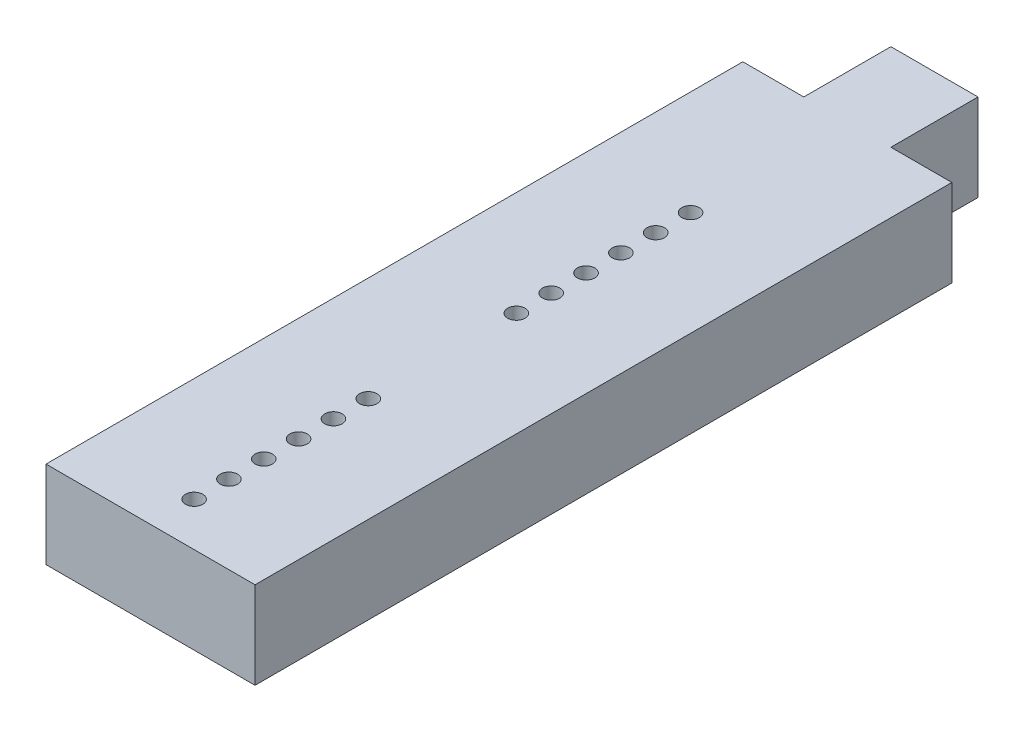
ISO-10303-21;
HEADER;
FILE_DESCRIPTION(('STEP AP214'),'2;1');
FILE_NAME('part.step','',(''),(''),'','','');
FILE_SCHEMA(('AUTOMOTIVE_DESIGN { 1 0 10303 214 1 1 1 1 }'));
ENDSEC;
DATA;
#1=APPLICATION_CONTEXT('core data for automotive mechanical design processes');
#2=APPLICATION_PROTOCOL_DEFINITION('international standard','automotive_design',2000,#1);
#3=PRODUCT_CONTEXT('',#1,'mechanical');
#4=PRODUCT('Part','Part','',(#3));
#5=PRODUCT_RELATED_PRODUCT_CATEGORY('part','',(#4));
#6=PRODUCT_DEFINITION_FORMATION('','',#4);
#7=PRODUCT_DEFINITION_CONTEXT('part definition',#1,'design');
#8=PRODUCT_DEFINITION('design','',#6,#7);
#9=PRODUCT_DEFINITION_SHAPE('','',#8);
#10=(LENGTH_UNIT() NAMED_UNIT(*) SI_UNIT(.MILLI.,.METRE.));
#11=(NAMED_UNIT(*) PLANE_ANGLE_UNIT() SI_UNIT($,.RADIAN.));
#12=(NAMED_UNIT(*) SI_UNIT($,.STERADIAN.) SOLID_ANGLE_UNIT());
#13=UNCERTAINTY_MEASURE_WITH_UNIT(LENGTH_MEASURE(1.E-05),#10,'distance_accuracy_value','');
#14=(GEOMETRIC_REPRESENTATION_CONTEXT(3) GLOBAL_UNCERTAINTY_ASSIGNED_CONTEXT((#13)) GLOBAL_UNIT_ASSIGNED_CONTEXT((#10,
#11,#12)) REPRESENTATION_CONTEXT('',''));
#15=CARTESIAN_POINT('',(0.,0.,0.));
#16=DIRECTION('',(0.,0.,1.));
#17=DIRECTION('',(1.,0.,0.));
#18=AXIS2_PLACEMENT_3D('',#15,#16,#17);
#19=CARTESIAN_POINT('',(0.,5.,0.));
#20=DIRECTION('',(0.,1.,0.));
#21=DIRECTION('',(0.,0.,1.));
#22=AXIS2_PLACEMENT_3D('',#19,#20,#21);
#23=PLANE('',#22);
#24=CARTESIAN_POINT('',(0.,5.,15.5));
#25=DIRECTION('',(0.,1.,0.));
#26=DIRECTION('',(0.,0.,1.));
#27=AXIS2_PLACEMENT_3D('',#24,#25,#26);
#28=CIRCLE('',#27,0.500000000000001);
#29=CARTESIAN_POINT('',(0.,5.,16.));
#30=VERTEX_POINT('',#29);
#31=EDGE_CURVE('E240',#30,#30,#28,.T.);
#32=ORIENTED_EDGE('',*,*,#31,.F.);
#33=EDGE_LOOP('',(#32));
#34=FACE_BOUND('',#33,.T.);
#35=CARTESIAN_POINT('',(0.,5.,11.5));
#36=DIRECTION('',(0.,1.,0.));
#37=DIRECTION('',(0.,0.,1.));
#38=AXIS2_PLACEMENT_3D('',#35,#36,#37);
#39=CIRCLE('',#38,0.500000000000001);
#40=CARTESIAN_POINT('',(0.,5.,12.));
#41=VERTEX_POINT('',#40);
#42=EDGE_CURVE('E228',#41,#41,#39,.T.);
#43=ORIENTED_EDGE('',*,*,#42,.F.);
#44=EDGE_LOOP('',(#43));
#45=FACE_BOUND('',#44,.T.);
#46=CARTESIAN_POINT('',(0.,5.,7.50000000000001));
#47=DIRECTION('',(0.,1.,0.));
#48=DIRECTION('',(0.,0.,1.));
#49=AXIS2_PLACEMENT_3D('',#46,#47,#48);
#50=CIRCLE('',#49,0.500000000000001);
#51=CARTESIAN_POINT('',(0.,5.,8.00000000000001));
#52=VERTEX_POINT('',#51);
#53=EDGE_CURVE('E216',#52,#52,#50,.T.);
#54=ORIENTED_EDGE('',*,*,#53,.F.);
#55=EDGE_LOOP('',(#54));
#56=FACE_BOUND('',#55,.T.);
#57=CARTESIAN_POINT('',(0.,5.,-3.));
#58=DIRECTION('',(0.,1.,0.));
#59=DIRECTION('',(0.,0.,1.));
#60=AXIS2_PLACEMENT_3D('',#57,#58,#59);
#61=CIRCLE('',#60,0.500000000000001);
#62=CARTESIAN_POINT('',(0.,5.,-2.5));
#63=VERTEX_POINT('',#62);
#64=EDGE_CURVE('E204',#63,#63,#61,.T.);
#65=ORIENTED_EDGE('',*,*,#64,.F.);
#66=EDGE_LOOP('',(#65));
#67=FACE_BOUND('',#66,.T.);
#68=CARTESIAN_POINT('',(0.,5.,-7.00000000000001));
#69=DIRECTION('',(0.,1.,0.));
#70=DIRECTION('',(0.,0.,1.));
#71=AXIS2_PLACEMENT_3D('',#68,#69,#70);
#72=CIRCLE('',#71,0.500000000000001);
#73=CARTESIAN_POINT('',(0.,5.,-6.50000000000001));
#74=VERTEX_POINT('',#73);
#75=EDGE_CURVE('E192',#74,#74,#72,.T.);
#76=ORIENTED_EDGE('',*,*,#75,.F.);
#77=EDGE_LOOP('',(#76));
#78=FACE_BOUND('',#77,.T.);
#79=CARTESIAN_POINT('',(0.,5.,-11.));
#80=DIRECTION('',(0.,1.,0.));
#81=DIRECTION('',(0.,0.,1.));
#82=AXIS2_PLACEMENT_3D('',#79,#80,#81);
#83=CIRCLE('',#82,0.500000000000001);
#84=CARTESIAN_POINT('',(0.,5.,-10.5));
#85=VERTEX_POINT('',#84);
#86=EDGE_CURVE('E138',#85,#85,#83,.T.);
#87=ORIENTED_EDGE('',*,*,#86,.F.);
#88=EDGE_LOOP('',(#87));
#89=FACE_BOUND('',#88,.T.);
#90=DIRECTION('',(0.,0.,-1.));
#91=VECTOR('',#90,1.);
#92=CARTESIAN_POINT('',(6.,5.,-20.0000000000001));
#93=LINE('',#92,#91);
#94=CARTESIAN_POINT('',(6.00000000000001,5.,19.9999999999999));
#95=VERTEX_POINT('',#94);
#96=CARTESIAN_POINT('',(6.,5.,-20.0000000000001));
#97=VERTEX_POINT('',#96);
#98=EDGE_CURVE('E149',#95,#97,#93,.T.);
#99=ORIENTED_EDGE('',*,*,#98,.T.);
#100=DIRECTION('',(-1.,0.,0.));
#101=VECTOR('',#100,1.);
#102=CARTESIAN_POINT('',(2.5,5.,-20.0000000000001));
#103=LINE('',#102,#101);
#104=CARTESIAN_POINT('',(2.5,5.,-20.0000000000001));
#105=VERTEX_POINT('',#104);
#106=EDGE_CURVE('E97',#97,#105,#103,.T.);
#107=ORIENTED_EDGE('',*,*,#106,.T.);
#108=DIRECTION('',(0.,0.,-1.));
#109=VECTOR('',#108,1.);
#110=CARTESIAN_POINT('',(2.49999999999993,5.,-25.));
#111=LINE('',#110,#109);
#112=CARTESIAN_POINT('',(2.49999999999993,5.,-25.));
#113=VERTEX_POINT('',#112);
#114=EDGE_CURVE('E164',#105,#113,#111,.T.);
#115=ORIENTED_EDGE('',*,*,#114,.T.);
#116=DIRECTION('',(-1.,0.,0.));
#117=VECTOR('',#116,1.);
#118=CARTESIAN_POINT('',(-2.50000000000007,5.,-25.0000000000003));
#119=LINE('',#118,#117);
#120=CARTESIAN_POINT('',(-2.50000000000007,5.,-25.0000000000003));
#121=VERTEX_POINT('',#120);
#122=EDGE_CURVE('E177',#113,#121,#119,.T.);
#123=ORIENTED_EDGE('',*,*,#122,.T.);
#124=DIRECTION('',(0.,0.,1.));
#125=VECTOR('',#124,1.);
#126=CARTESIAN_POINT('',(-2.5,5.,-20.));
#127=LINE('',#126,#125);
#128=CARTESIAN_POINT('',(-2.5,5.,-20.));
#129=VERTEX_POINT('',#128);
#130=EDGE_CURVE('E116',#121,#129,#127,.T.);
#131=ORIENTED_EDGE('',*,*,#130,.T.);
#132=DIRECTION('',(-1.,0.,0.));
#133=VECTOR('',#132,1.);
#134=CARTESIAN_POINT('',(-6.00000000000001,5.,-20.));
#135=LINE('',#134,#133);
#136=CARTESIAN_POINT('',(-6.00000000000001,5.,-20.));
#137=VERTEX_POINT('',#136);
#138=EDGE_CURVE('E110',#129,#137,#135,.T.);
#139=ORIENTED_EDGE('',*,*,#138,.T.);
#140=DIRECTION('',(0.,0.,1.));
#141=VECTOR('',#140,1.);
#142=CARTESIAN_POINT('',(-6.00000000000001,5.,-20.));
#143=LINE('',#142,#141);
#144=CARTESIAN_POINT('',(-6.,5.,20.));
#145=VERTEX_POINT('',#144);
#146=EDGE_CURVE('E114',#137,#145,#143,.T.);
#147=ORIENTED_EDGE('',*,*,#146,.T.);
#148=DIRECTION('',(1.,0.,0.));
#149=VECTOR('',#148,1.);
#150=CARTESIAN_POINT('',(-6.,5.,20.));
#151=LINE('',#150,#149);
#152=EDGE_CURVE('E54',#145,#95,#151,.T.);
#153=ORIENTED_EDGE('',*,*,#152,.T.);
#154=EDGE_LOOP('',(#99,#107,#115,#123,#131,#139,#147,#153));
#155=FACE_BOUND('',#154,.T.);
#156=CARTESIAN_POINT('',(0.,5.,-9.00000000000001));
#157=DIRECTION('',(0.,1.,0.));
#158=DIRECTION('',(0.,0.,1.));
#159=AXIS2_PLACEMENT_3D('',#156,#157,#158);
#160=CIRCLE('',#159,0.500000000000001);
#161=CARTESIAN_POINT('',(0.,5.,-8.50000000000001));
#162=VERTEX_POINT('',#161);
#163=EDGE_CURVE('E186',#162,#162,#160,.T.);
#164=ORIENTED_EDGE('',*,*,#163,.F.);
#165=EDGE_LOOP('',(#164));
#166=FACE_BOUND('',#165,.T.);
#167=CARTESIAN_POINT('',(0.,5.,-5.));
#168=DIRECTION('',(0.,1.,0.));
#169=DIRECTION('',(0.,0.,1.));
#170=AXIS2_PLACEMENT_3D('',#167,#168,#169);
#171=CIRCLE('',#170,0.500000000000001);
#172=CARTESIAN_POINT('',(0.,5.,-4.5));
#173=VERTEX_POINT('',#172);
#174=EDGE_CURVE('E198',#173,#173,#171,.T.);
#175=ORIENTED_EDGE('',*,*,#174,.F.);
#176=EDGE_LOOP('',(#175));
#177=FACE_BOUND('',#176,.T.);
#178=CARTESIAN_POINT('',(0.,5.,-1.));
#179=DIRECTION('',(0.,1.,0.));
#180=DIRECTION('',(0.,0.,1.));
#181=AXIS2_PLACEMENT_3D('',#178,#179,#180);
#182=CIRCLE('',#181,0.5);
#183=CARTESIAN_POINT('',(0.,5.,-0.500000000000001));
#184=VERTEX_POINT('',#183);
#185=EDGE_CURVE('E210',#184,#184,#182,.T.);
#186=ORIENTED_EDGE('',*,*,#185,.F.);
#187=EDGE_LOOP('',(#186));
#188=FACE_BOUND('',#187,.T.);
#189=CARTESIAN_POINT('',(0.,5.,9.49999999999999));
#190=DIRECTION('',(0.,1.,0.));
#191=DIRECTION('',(0.,0.,1.));
#192=AXIS2_PLACEMENT_3D('',#189,#190,#191);
#193=CIRCLE('',#192,0.500000000000001);
#194=CARTESIAN_POINT('',(0.,5.,9.99999999999999));
#195=VERTEX_POINT('',#194);
#196=EDGE_CURVE('E222',#195,#195,#193,.T.);
#197=ORIENTED_EDGE('',*,*,#196,.F.);
#198=EDGE_LOOP('',(#197));
#199=FACE_BOUND('',#198,.T.);
#200=CARTESIAN_POINT('',(0.,5.,13.5));
#201=DIRECTION('',(0.,1.,0.));
#202=DIRECTION('',(0.,0.,1.));
#203=AXIS2_PLACEMENT_3D('',#200,#201,#202);
#204=CIRCLE('',#203,0.500000000000001);
#205=CARTESIAN_POINT('',(0.,5.,14.));
#206=VERTEX_POINT('',#205);
#207=EDGE_CURVE('E234',#206,#206,#204,.T.);
#208=ORIENTED_EDGE('',*,*,#207,.F.);
#209=EDGE_LOOP('',(#208));
#210=FACE_BOUND('',#209,.T.);
#211=CARTESIAN_POINT('',(1.04083408558608E-13,5.,17.5));
#212=DIRECTION('',(0.,1.,0.));
#213=DIRECTION('',(0.,0.,1.));
#214=AXIS2_PLACEMENT_3D('',#211,#212,#213);
#215=CIRCLE('',#214,0.500000000000001);
#216=CARTESIAN_POINT('',(1.04360964314765E-13,5.,18.));
#217=VERTEX_POINT('',#216);
#218=EDGE_CURVE('E246',#217,#217,#215,.T.);
#219=ORIENTED_EDGE('',*,*,#218,.F.);
#220=EDGE_LOOP('',(#219));
#221=FACE_BOUND('',#220,.T.);
#222=ADVANCED_FACE('F37',(#34,#45,#56,#67,#78,#89,#155,#166,#177,#188,#199,#210,#221),#23,.T.);
#223=CARTESIAN_POINT('',(0.,0.,0.));
#224=DIRECTION('',(0.,1.,0.));
#225=DIRECTION('',(0.,0.,1.));
#226=AXIS2_PLACEMENT_3D('',#223,#224,#225);
#227=PLANE('',#226);
#228=DIRECTION('',(0.,0.,-1.));
#229=VECTOR('',#228,1.);
#230=CARTESIAN_POINT('',(6.,0.,-20.0000000000001));
#231=LINE('',#230,#229);
#232=CARTESIAN_POINT('',(6.00000000000001,0.,19.9999999999999));
#233=VERTEX_POINT('',#232);
#234=CARTESIAN_POINT('',(6.,0.,-20.0000000000001));
#235=VERTEX_POINT('',#234);
#236=EDGE_CURVE('E134',#233,#235,#231,.T.);
#237=ORIENTED_EDGE('',*,*,#236,.F.);
#238=DIRECTION('',(1.,0.,0.));
#239=VECTOR('',#238,1.);
#240=CARTESIAN_POINT('',(-6.,0.,20.));
#241=LINE('',#240,#239);
#242=CARTESIAN_POINT('',(-6.,0.,20.));
#243=VERTEX_POINT('',#242);
#244=EDGE_CURVE('E89',#243,#233,#241,.T.);
#245=ORIENTED_EDGE('',*,*,#244,.F.);
#246=DIRECTION('',(0.,0.,1.));
#247=VECTOR('',#246,1.);
#248=CARTESIAN_POINT('',(-6.00000000000001,0.,-20.));
#249=LINE('',#248,#247);
#250=CARTESIAN_POINT('',(-6.00000000000001,0.,-20.));
#251=VERTEX_POINT('',#250);
#252=EDGE_CURVE('E83',#251,#243,#249,.T.);
#253=ORIENTED_EDGE('',*,*,#252,.F.);
#254=DIRECTION('',(-1.,0.,0.));
#255=VECTOR('',#254,1.);
#256=CARTESIAN_POINT('',(-6.00000000000001,0.,-20.));
#257=LINE('',#256,#255);
#258=CARTESIAN_POINT('',(-2.5,0.,-20.));
#259=VERTEX_POINT('',#258);
#260=EDGE_CURVE('E124',#259,#251,#257,.T.);
#261=ORIENTED_EDGE('',*,*,#260,.F.);
#262=DIRECTION('',(0.,0.,1.));
#263=VECTOR('',#262,1.);
#264=CARTESIAN_POINT('',(-2.5,0.,-20.));
#265=LINE('',#264,#263);
#266=CARTESIAN_POINT('',(-2.50000000000007,0.,-25.0000000000003));
#267=VERTEX_POINT('',#266);
#268=EDGE_CURVE('E144',#267,#259,#265,.T.);
#269=ORIENTED_EDGE('',*,*,#268,.F.);
#270=DIRECTION('',(-1.,0.,0.));
#271=VECTOR('',#270,1.);
#272=CARTESIAN_POINT('',(-2.50000000000007,0.,-25.0000000000003));
#273=LINE('',#272,#271);
#274=CARTESIAN_POINT('',(2.49999999999993,0.,-25.));
#275=VERTEX_POINT('',#274);
#276=EDGE_CURVE('E142',#275,#267,#273,.T.);
#277=ORIENTED_EDGE('',*,*,#276,.F.);
#278=DIRECTION('',(0.,0.,-1.));
#279=VECTOR('',#278,1.);
#280=CARTESIAN_POINT('',(2.49999999999993,0.,-25.));
#281=LINE('',#280,#279);
#282=CARTESIAN_POINT('',(2.5,0.,-20.0000000000001));
#283=VERTEX_POINT('',#282);
#284=EDGE_CURVE('E140',#283,#275,#281,.T.);
#285=ORIENTED_EDGE('',*,*,#284,.F.);
#286=DIRECTION('',(-1.,0.,0.));
#287=VECTOR('',#286,1.);
#288=CARTESIAN_POINT('',(2.5,0.,-20.0000000000001));
#289=LINE('',#288,#287);
#290=EDGE_CURVE('E137',#235,#283,#289,.T.);
#291=ORIENTED_EDGE('',*,*,#290,.F.);
#292=EDGE_LOOP('',(#237,#245,#253,#261,#269,#277,#285,#291));
#293=FACE_BOUND('',#292,.T.);
#294=CARTESIAN_POINT('',(0.,0.,-11.));
#295=DIRECTION('',(0.,1.,0.));
#296=DIRECTION('',(0.,0.,1.));
#297=AXIS2_PLACEMENT_3D('',#294,#295,#296);
#298=CIRCLE('',#297,0.500000000000001);
#299=CARTESIAN_POINT('',(0.,0.,-10.5));
#300=VERTEX_POINT('',#299);
#301=EDGE_CURVE('E183',#300,#300,#298,.T.);
#302=ORIENTED_EDGE('',*,*,#301,.T.);
#303=EDGE_LOOP('',(#302));
#304=FACE_BOUND('',#303,.T.);
#305=CARTESIAN_POINT('',(0.,0.,-9.00000000000001));
#306=DIRECTION('',(0.,1.,0.));
#307=DIRECTION('',(0.,0.,1.));
#308=AXIS2_PLACEMENT_3D('',#305,#306,#307);
#309=CIRCLE('',#308,0.500000000000001);
#310=CARTESIAN_POINT('',(0.,0.,-8.50000000000001));
#311=VERTEX_POINT('',#310);
#312=EDGE_CURVE('E189',#311,#311,#309,.T.);
#313=ORIENTED_EDGE('',*,*,#312,.T.);
#314=EDGE_LOOP('',(#313));
#315=FACE_BOUND('',#314,.T.);
#316=CARTESIAN_POINT('',(0.,0.,-7.00000000000001));
#317=DIRECTION('',(0.,1.,0.));
#318=DIRECTION('',(0.,0.,1.));
#319=AXIS2_PLACEMENT_3D('',#316,#317,#318);
#320=CIRCLE('',#319,0.500000000000001);
#321=CARTESIAN_POINT('',(0.,0.,-6.50000000000001));
#322=VERTEX_POINT('',#321);
#323=EDGE_CURVE('E195',#322,#322,#320,.T.);
#324=ORIENTED_EDGE('',*,*,#323,.T.);
#325=EDGE_LOOP('',(#324));
#326=FACE_BOUND('',#325,.T.);
#327=CARTESIAN_POINT('',(0.,0.,-5.));
#328=DIRECTION('',(0.,1.,0.));
#329=DIRECTION('',(0.,0.,1.));
#330=AXIS2_PLACEMENT_3D('',#327,#328,#329);
#331=CIRCLE('',#330,0.500000000000001);
#332=CARTESIAN_POINT('',(0.,0.,-4.5));
#333=VERTEX_POINT('',#332);
#334=EDGE_CURVE('E201',#333,#333,#331,.T.);
#335=ORIENTED_EDGE('',*,*,#334,.T.);
#336=EDGE_LOOP('',(#335));
#337=FACE_BOUND('',#336,.T.);
#338=CARTESIAN_POINT('',(0.,0.,-3.));
#339=DIRECTION('',(0.,1.,0.));
#340=DIRECTION('',(0.,0.,1.));
#341=AXIS2_PLACEMENT_3D('',#338,#339,#340);
#342=CIRCLE('',#341,0.500000000000001);
#343=CARTESIAN_POINT('',(0.,0.,-2.5));
#344=VERTEX_POINT('',#343);
#345=EDGE_CURVE('E207',#344,#344,#342,.T.);
#346=ORIENTED_EDGE('',*,*,#345,.T.);
#347=EDGE_LOOP('',(#346));
#348=FACE_BOUND('',#347,.T.);
#349=CARTESIAN_POINT('',(0.,0.,-1.));
#350=DIRECTION('',(0.,1.,0.));
#351=DIRECTION('',(0.,0.,1.));
#352=AXIS2_PLACEMENT_3D('',#349,#350,#351);
#353=CIRCLE('',#352,0.5);
#354=CARTESIAN_POINT('',(0.,0.,-0.500000000000001));
#355=VERTEX_POINT('',#354);
#356=EDGE_CURVE('E213',#355,#355,#353,.T.);
#357=ORIENTED_EDGE('',*,*,#356,.T.);
#358=EDGE_LOOP('',(#357));
#359=FACE_BOUND('',#358,.T.);
#360=CARTESIAN_POINT('',(0.,0.,7.50000000000001));
#361=DIRECTION('',(0.,1.,0.));
#362=DIRECTION('',(0.,0.,1.));
#363=AXIS2_PLACEMENT_3D('',#360,#361,#362);
#364=CIRCLE('',#363,0.500000000000001);
#365=CARTESIAN_POINT('',(0.,0.,8.00000000000001));
#366=VERTEX_POINT('',#365);
#367=EDGE_CURVE('E219',#366,#366,#364,.T.);
#368=ORIENTED_EDGE('',*,*,#367,.T.);
#369=EDGE_LOOP('',(#368));
#370=FACE_BOUND('',#369,.T.);
#371=CARTESIAN_POINT('',(0.,0.,9.49999999999999));
#372=DIRECTION('',(0.,1.,0.));
#373=DIRECTION('',(0.,0.,1.));
#374=AXIS2_PLACEMENT_3D('',#371,#372,#373);
#375=CIRCLE('',#374,0.500000000000001);
#376=CARTESIAN_POINT('',(0.,0.,9.99999999999999));
#377=VERTEX_POINT('',#376);
#378=EDGE_CURVE('E225',#377,#377,#375,.T.);
#379=ORIENTED_EDGE('',*,*,#378,.T.);
#380=EDGE_LOOP('',(#379));
#381=FACE_BOUND('',#380,.T.);
#382=CARTESIAN_POINT('',(0.,0.,11.5));
#383=DIRECTION('',(0.,1.,0.));
#384=DIRECTION('',(0.,0.,1.));
#385=AXIS2_PLACEMENT_3D('',#382,#383,#384);
#386=CIRCLE('',#385,0.500000000000001);
#387=CARTESIAN_POINT('',(0.,0.,12.));
#388=VERTEX_POINT('',#387);
#389=EDGE_CURVE('E231',#388,#388,#386,.T.);
#390=ORIENTED_EDGE('',*,*,#389,.T.);
#391=EDGE_LOOP('',(#390));
#392=FACE_BOUND('',#391,.T.);
#393=CARTESIAN_POINT('',(0.,0.,13.5));
#394=DIRECTION('',(0.,1.,0.));
#395=DIRECTION('',(0.,0.,1.));
#396=AXIS2_PLACEMENT_3D('',#393,#394,#395);
#397=CIRCLE('',#396,0.500000000000001);
#398=CARTESIAN_POINT('',(0.,0.,14.));
#399=VERTEX_POINT('',#398);
#400=EDGE_CURVE('E237',#399,#399,#397,.T.);
#401=ORIENTED_EDGE('',*,*,#400,.T.);
#402=EDGE_LOOP('',(#401));
#403=FACE_BOUND('',#402,.T.);
#404=CARTESIAN_POINT('',(0.,0.,15.5));
#405=DIRECTION('',(0.,1.,0.));
#406=DIRECTION('',(0.,0.,1.));
#407=AXIS2_PLACEMENT_3D('',#404,#405,#406);
#408=CIRCLE('',#407,0.500000000000001);
#409=CARTESIAN_POINT('',(0.,0.,16.));
#410=VERTEX_POINT('',#409);
#411=EDGE_CURVE('E243',#410,#410,#408,.T.);
#412=ORIENTED_EDGE('',*,*,#411,.T.);
#413=EDGE_LOOP('',(#412));
#414=FACE_BOUND('',#413,.T.);
#415=CARTESIAN_POINT('',(1.04083408558608E-13,0.,17.5));
#416=DIRECTION('',(0.,1.,0.));
#417=DIRECTION('',(0.,0.,1.));
#418=AXIS2_PLACEMENT_3D('',#415,#416,#417);
#419=CIRCLE('',#418,0.500000000000001);
#420=CARTESIAN_POINT('',(1.04360964314765E-13,0.,18.));
#421=VERTEX_POINT('',#420);
#422=EDGE_CURVE('E249',#421,#421,#419,.T.);
#423=ORIENTED_EDGE('',*,*,#422,.T.);
#424=EDGE_LOOP('',(#423));
#425=FACE_BOUND('',#424,.T.);
#426=ADVANCED_FACE('F168',(#293,#304,#315,#326,#337,#348,#359,#370,#381,#392,#403,#414,#425),
#227,.F.);
#427=CARTESIAN_POINT('',(6.,5.,-20.0000000000001));
#428=DIRECTION('',(-1.,0.,0.));
#429=DIRECTION('',(0.,0.,1.));
#430=AXIS2_PLACEMENT_3D('',#427,#428,#429);
#431=PLANE('',#430);
#432=ORIENTED_EDGE('',*,*,#236,.T.);
#433=DIRECTION('',(0.,-1.,0.));
#434=VECTOR('',#433,1.);
#435=CARTESIAN_POINT('',(6.,5.,-20.0000000000001));
#436=LINE('',#435,#434);
#437=EDGE_CURVE('E11',#97,#235,#436,.T.);
#438=ORIENTED_EDGE('',*,*,#437,.F.);
#439=ORIENTED_EDGE('',*,*,#98,.F.);
#440=DIRECTION('',(0.,-1.,0.));
#441=VECTOR('',#440,1.);
#442=CARTESIAN_POINT('',(6.00000000000001,5.,19.9999999999999));
#443=LINE('',#442,#441);
#444=EDGE_CURVE('E130',#95,#233,#443,.T.);
#445=ORIENTED_EDGE('',*,*,#444,.T.);
#446=EDGE_LOOP('',(#432,#438,#439,#445));
#447=FACE_BOUND('',#446,.T.);
#448=ADVANCED_FACE('F39',(#447),#431,.F.);
#449=CARTESIAN_POINT('',(2.5,5.,-20.0000000000001));
#450=DIRECTION('',(0.,0.,1.));
#451=DIRECTION('',(1.,0.,0.));
#452=AXIS2_PLACEMENT_3D('',#449,#450,#451);
#453=PLANE('',#452);
#454=ORIENTED_EDGE('',*,*,#290,.T.);
#455=DIRECTION('',(0.,-1.,0.));
#456=VECTOR('',#455,1.);
#457=CARTESIAN_POINT('',(2.5,5.,-20.0000000000001));
#458=LINE('',#457,#456);
#459=EDGE_CURVE('E46',#105,#283,#458,.T.);
#460=ORIENTED_EDGE('',*,*,#459,.F.);
#461=ORIENTED_EDGE('',*,*,#106,.F.);
#462=ORIENTED_EDGE('',*,*,#437,.T.);
#463=EDGE_LOOP('',(#454,#460,#461,#462));
#464=FACE_BOUND('',#463,.T.);
#465=ADVANCED_FACE('F283',(#464),#453,.F.);
#466=CARTESIAN_POINT('',(2.49999999999993,5.,-25.));
#467=DIRECTION('',(-1.,0.,0.));
#468=DIRECTION('',(0.,0.,1.));
#469=AXIS2_PLACEMENT_3D('',#466,#467,#468);
#470=PLANE('',#469);
#471=ORIENTED_EDGE('',*,*,#284,.T.);
#472=DIRECTION('',(0.,-1.,0.));
#473=VECTOR('',#472,1.);
#474=CARTESIAN_POINT('',(2.49999999999993,5.,-25.));
#475=LINE('',#474,#473);
#476=EDGE_CURVE('E156',#113,#275,#475,.T.);
#477=ORIENTED_EDGE('',*,*,#476,.F.);
#478=ORIENTED_EDGE('',*,*,#114,.F.);
#479=ORIENTED_EDGE('',*,*,#459,.T.);
#480=EDGE_LOOP('',(#471,#477,#478,#479));
#481=FACE_BOUND('',#480,.T.);
#482=ADVANCED_FACE('F162',(#481),#470,.F.);
#483=CARTESIAN_POINT('',(-2.50000000000007,5.,-25.0000000000003));
#484=DIRECTION('',(0.,0.,1.));
#485=DIRECTION('',(1.,0.,0.));
#486=AXIS2_PLACEMENT_3D('',#483,#484,#485);
#487=PLANE('',#486);
#488=ORIENTED_EDGE('',*,*,#276,.T.);
#489=DIRECTION('',(0.,-1.,0.));
#490=VECTOR('',#489,1.);
#491=CARTESIAN_POINT('',(-2.50000000000007,5.,-25.0000000000003));
#492=LINE('',#491,#490);
#493=EDGE_CURVE('E153',#121,#267,#492,.T.);
#494=ORIENTED_EDGE('',*,*,#493,.F.);
#495=ORIENTED_EDGE('',*,*,#122,.F.);
#496=ORIENTED_EDGE('',*,*,#476,.T.);
#497=EDGE_LOOP('',(#488,#494,#495,#496));
#498=FACE_BOUND('',#497,.T.);
#499=ADVANCED_FACE('F173',(#498),#487,.F.);
#500=CARTESIAN_POINT('',(-2.5,5.,-20.));
#501=DIRECTION('',(1.,0.,0.));
#502=DIRECTION('',(0.,0.,-1.));
#503=AXIS2_PLACEMENT_3D('',#500,#501,#502);
#504=PLANE('',#503);
#505=ORIENTED_EDGE('',*,*,#268,.T.);
#506=DIRECTION('',(0.,-1.,0.));
#507=VECTOR('',#506,1.);
#508=CARTESIAN_POINT('',(-2.5,5.,-20.));
#509=LINE('',#508,#507);
#510=EDGE_CURVE('E125',#129,#259,#509,.T.);
#511=ORIENTED_EDGE('',*,*,#510,.F.);
#512=ORIENTED_EDGE('',*,*,#130,.F.);
#513=ORIENTED_EDGE('',*,*,#493,.T.);
#514=EDGE_LOOP('',(#505,#511,#512,#513));
#515=FACE_BOUND('',#514,.T.);
#516=ADVANCED_FACE('F176',(#515),#504,.F.);
#517=CARTESIAN_POINT('',(-6.00000000000001,5.,-20.));
#518=DIRECTION('',(0.,0.,1.));
#519=DIRECTION('',(1.,0.,0.));
#520=AXIS2_PLACEMENT_3D('',#517,#518,#519);
#521=PLANE('',#520);
#522=ORIENTED_EDGE('',*,*,#260,.T.);
#523=DIRECTION('',(0.,-1.,0.));
#524=VECTOR('',#523,1.);
#525=CARTESIAN_POINT('',(-6.00000000000001,5.,-20.));
#526=LINE('',#525,#524);
#527=EDGE_CURVE('E121',#137,#251,#526,.T.);
#528=ORIENTED_EDGE('',*,*,#527,.F.);
#529=ORIENTED_EDGE('',*,*,#138,.F.);
#530=ORIENTED_EDGE('',*,*,#510,.T.);
#531=EDGE_LOOP('',(#522,#528,#529,#530));
#532=FACE_BOUND('',#531,.T.);
#533=ADVANCED_FACE('F122',(#532),#521,.F.);
#534=CARTESIAN_POINT('',(-6.00000000000001,5.,-20.));
#535=DIRECTION('',(1.,0.,0.));
#536=DIRECTION('',(0.,0.,-1.));
#537=AXIS2_PLACEMENT_3D('',#534,#535,#536);
#538=PLANE('',#537);
#539=ORIENTED_EDGE('',*,*,#252,.T.);
#540=DIRECTION('',(0.,-1.,0.));
#541=VECTOR('',#540,1.);
#542=CARTESIAN_POINT('',(-6.,5.,20.));
#543=LINE('',#542,#541);
#544=EDGE_CURVE('E126',#145,#243,#543,.T.);
#545=ORIENTED_EDGE('',*,*,#544,.F.);
#546=ORIENTED_EDGE('',*,*,#146,.F.);
#547=ORIENTED_EDGE('',*,*,#527,.T.);
#548=EDGE_LOOP('',(#539,#545,#546,#547));
#549=FACE_BOUND('',#548,.T.);
#550=ADVANCED_FACE('F128',(#549),#538,.F.);
#551=CARTESIAN_POINT('',(-6.,5.,20.));
#552=DIRECTION('',(0.,0.,-1.));
#553=DIRECTION('',(-1.,0.,0.));
#554=AXIS2_PLACEMENT_3D('',#551,#552,#553);
#555=PLANE('',#554);
#556=ORIENTED_EDGE('',*,*,#244,.T.);
#557=ORIENTED_EDGE('',*,*,#444,.F.);
#558=ORIENTED_EDGE('',*,*,#152,.F.);
#559=ORIENTED_EDGE('',*,*,#544,.T.);
#560=EDGE_LOOP('',(#556,#557,#558,#559));
#561=FACE_BOUND('',#560,.T.);
#562=ADVANCED_FACE('F271',(#561),#555,.F.);
#563=CARTESIAN_POINT('',(0.,5.,-11.));
#564=DIRECTION('',(0.,-1.,0.));
#565=DIRECTION('',(0.,0.,-1.));
#566=AXIS2_PLACEMENT_3D('',#563,#564,#565);
#567=CYLINDRICAL_SURFACE('',#566,0.500000000000001);
#568=ORIENTED_EDGE('',*,*,#86,.T.);
#569=EDGE_LOOP('',(#568));
#570=FACE_BOUND('',#569,.T.);
#571=ORIENTED_EDGE('',*,*,#301,.F.);
#572=EDGE_LOOP('',(#571));
#573=FACE_BOUND('',#572,.T.);
#574=ADVANCED_FACE('F268',(#570,#573),#567,.F.);
#575=CARTESIAN_POINT('',(0.,5.,-9.00000000000001));
#576=DIRECTION('',(0.,-1.,0.));
#577=DIRECTION('',(0.,0.,-1.));
#578=AXIS2_PLACEMENT_3D('',#575,#576,#577);
#579=CYLINDRICAL_SURFACE('',#578,0.500000000000001);
#580=ORIENTED_EDGE('',*,*,#163,.T.);
#581=EDGE_LOOP('',(#580));
#582=FACE_BOUND('',#581,.T.);
#583=ORIENTED_EDGE('',*,*,#312,.F.);
#584=EDGE_LOOP('',(#583));
#585=FACE_BOUND('',#584,.T.);
#586=ADVANCED_FACE('F338',(#582,#585),#579,.F.);
#587=CARTESIAN_POINT('',(0.,5.,-7.00000000000001));
#588=DIRECTION('',(0.,-1.,0.));
#589=DIRECTION('',(0.,0.,-1.));
#590=AXIS2_PLACEMENT_3D('',#587,#588,#589);
#591=CYLINDRICAL_SURFACE('',#590,0.500000000000001);
#592=ORIENTED_EDGE('',*,*,#75,.T.);
#593=EDGE_LOOP('',(#592));
#594=FACE_BOUND('',#593,.T.);
#595=ORIENTED_EDGE('',*,*,#323,.F.);
#596=EDGE_LOOP('',(#595));
#597=FACE_BOUND('',#596,.T.);
#598=ADVANCED_FACE('F345',(#594,#597),#591,.F.);
#599=CARTESIAN_POINT('',(0.,5.,-5.));
#600=DIRECTION('',(0.,-1.,0.));
#601=DIRECTION('',(0.,0.,-1.));
#602=AXIS2_PLACEMENT_3D('',#599,#600,#601);
#603=CYLINDRICAL_SURFACE('',#602,0.500000000000001);
#604=ORIENTED_EDGE('',*,*,#174,.T.);
#605=EDGE_LOOP('',(#604));
#606=FACE_BOUND('',#605,.T.);
#607=ORIENTED_EDGE('',*,*,#334,.F.);
#608=EDGE_LOOP('',(#607));
#609=FACE_BOUND('',#608,.T.);
#610=ADVANCED_FACE('F352',(#606,#609),#603,.F.);
#611=CARTESIAN_POINT('',(0.,5.,-3.));
#612=DIRECTION('',(0.,-1.,0.));
#613=DIRECTION('',(0.,0.,-1.));
#614=AXIS2_PLACEMENT_3D('',#611,#612,#613);
#615=CYLINDRICAL_SURFACE('',#614,0.500000000000001);
#616=ORIENTED_EDGE('',*,*,#64,.T.);
#617=EDGE_LOOP('',(#616));
#618=FACE_BOUND('',#617,.T.);
#619=ORIENTED_EDGE('',*,*,#345,.F.);
#620=EDGE_LOOP('',(#619));
#621=FACE_BOUND('',#620,.T.);
#622=ADVANCED_FACE('F360',(#618,#621),#615,.F.);
#623=CARTESIAN_POINT('',(0.,5.,-1.));
#624=DIRECTION('',(0.,-1.,0.));
#625=DIRECTION('',(0.,0.,-1.));
#626=AXIS2_PLACEMENT_3D('',#623,#624,#625);
#627=CYLINDRICAL_SURFACE('',#626,0.5);
#628=ORIENTED_EDGE('',*,*,#185,.T.);
#629=EDGE_LOOP('',(#628));
#630=FACE_BOUND('',#629,.T.);
#631=ORIENTED_EDGE('',*,*,#356,.F.);
#632=EDGE_LOOP('',(#631));
#633=FACE_BOUND('',#632,.T.);
#634=ADVANCED_FACE('F368',(#630,#633),#627,.F.);
#635=CARTESIAN_POINT('',(0.,5.,7.50000000000001));
#636=DIRECTION('',(0.,-1.,0.));
#637=DIRECTION('',(0.,0.,-1.));
#638=AXIS2_PLACEMENT_3D('',#635,#636,#637);
#639=CYLINDRICAL_SURFACE('',#638,0.500000000000001);
#640=ORIENTED_EDGE('',*,*,#53,.T.);
#641=EDGE_LOOP('',(#640));
#642=FACE_BOUND('',#641,.T.);
#643=ORIENTED_EDGE('',*,*,#367,.F.);
#644=EDGE_LOOP('',(#643));
#645=FACE_BOUND('',#644,.T.);
#646=ADVANCED_FACE('F376',(#642,#645),#639,.F.);
#647=CARTESIAN_POINT('',(0.,5.,9.49999999999999));
#648=DIRECTION('',(0.,-1.,0.));
#649=DIRECTION('',(0.,0.,-1.));
#650=AXIS2_PLACEMENT_3D('',#647,#648,#649);
#651=CYLINDRICAL_SURFACE('',#650,0.500000000000001);
#652=ORIENTED_EDGE('',*,*,#196,.T.);
#653=EDGE_LOOP('',(#652));
#654=FACE_BOUND('',#653,.T.);
#655=ORIENTED_EDGE('',*,*,#378,.F.);
#656=EDGE_LOOP('',(#655));
#657=FACE_BOUND('',#656,.T.);
#658=ADVANCED_FACE('F384',(#654,#657),#651,.F.);
#659=CARTESIAN_POINT('',(0.,5.,11.5));
#660=DIRECTION('',(0.,-1.,0.));
#661=DIRECTION('',(0.,0.,-1.));
#662=AXIS2_PLACEMENT_3D('',#659,#660,#661);
#663=CYLINDRICAL_SURFACE('',#662,0.500000000000001);
#664=ORIENTED_EDGE('',*,*,#42,.T.);
#665=EDGE_LOOP('',(#664));
#666=FACE_BOUND('',#665,.T.);
#667=ORIENTED_EDGE('',*,*,#389,.F.);
#668=EDGE_LOOP('',(#667));
#669=FACE_BOUND('',#668,.T.);
#670=ADVANCED_FACE('F392',(#666,#669),#663,.F.);
#671=CARTESIAN_POINT('',(0.,5.,13.5));
#672=DIRECTION('',(0.,-1.,0.));
#673=DIRECTION('',(0.,0.,-1.));
#674=AXIS2_PLACEMENT_3D('',#671,#672,#673);
#675=CYLINDRICAL_SURFACE('',#674,0.500000000000001);
#676=ORIENTED_EDGE('',*,*,#207,.T.);
#677=EDGE_LOOP('',(#676));
#678=FACE_BOUND('',#677,.T.);
#679=ORIENTED_EDGE('',*,*,#400,.F.);
#680=EDGE_LOOP('',(#679));
#681=FACE_BOUND('',#680,.T.);
#682=ADVANCED_FACE('F400',(#678,#681),#675,.F.);
#683=CARTESIAN_POINT('',(0.,5.,15.5));
#684=DIRECTION('',(0.,-1.,0.));
#685=DIRECTION('',(0.,0.,-1.));
#686=AXIS2_PLACEMENT_3D('',#683,#684,#685);
#687=CYLINDRICAL_SURFACE('',#686,0.500000000000001);
#688=ORIENTED_EDGE('',*,*,#31,.T.);
#689=EDGE_LOOP('',(#688));
#690=FACE_BOUND('',#689,.T.);
#691=ORIENTED_EDGE('',*,*,#411,.F.);
#692=EDGE_LOOP('',(#691));
#693=FACE_BOUND('',#692,.T.);
#694=ADVANCED_FACE('F408',(#690,#693),#687,.F.);
#695=CARTESIAN_POINT('',(1.04083408558608E-13,5.,17.5));
#696=DIRECTION('',(0.,-1.,0.));
#697=DIRECTION('',(0.,0.,-1.));
#698=AXIS2_PLACEMENT_3D('',#695,#696,#697);
#699=CYLINDRICAL_SURFACE('',#698,0.500000000000001);
#700=ORIENTED_EDGE('',*,*,#218,.T.);
#701=EDGE_LOOP('',(#700));
#702=FACE_BOUND('',#701,.T.);
#703=ORIENTED_EDGE('',*,*,#422,.F.);
#704=EDGE_LOOP('',(#703));
#705=FACE_BOUND('',#704,.T.);
#706=ADVANCED_FACE('F255',(#702,#705),#699,.F.);
#707=CLOSED_SHELL('',(#222,#426,#448,#465,#482,#499,#516,#533,#550,#562,#574,#586,#598,#610,
#622,#634,#646,#658,#670,#682,#694,#706));
#708=MANIFOLD_SOLID_BREP('B2',#707);
#709=ADVANCED_BREP_SHAPE_REPRESENTATION('',(#18,#708),#14);
#710=SHAPE_DEFINITION_REPRESENTATION(#9,#709);
ENDSEC;
END-ISO-10303-21;
